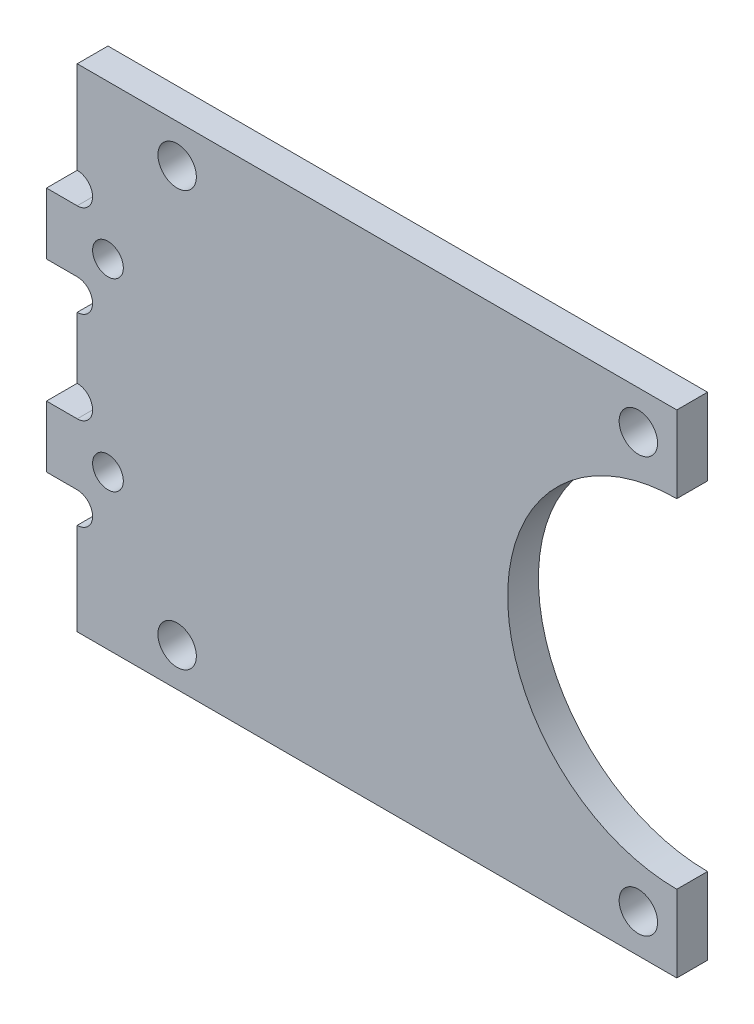
ISO-10303-21;
HEADER;
FILE_DESCRIPTION(('STEP AP214'),'2;1');
FILE_NAME('part.step','',(''),(''),'','','');
FILE_SCHEMA(('AUTOMOTIVE_DESIGN { 1 0 10303 214 1 1 1 1 }'));
ENDSEC;
DATA;
#1=APPLICATION_CONTEXT('core data for automotive mechanical design processes');
#2=APPLICATION_PROTOCOL_DEFINITION('international standard','automotive_design',2000,#1);
#3=PRODUCT_CONTEXT('',#1,'mechanical');
#4=PRODUCT('Part','Part','',(#3));
#5=PRODUCT_RELATED_PRODUCT_CATEGORY('part','',(#4));
#6=PRODUCT_DEFINITION_FORMATION('','',#4);
#7=PRODUCT_DEFINITION_CONTEXT('part definition',#1,'design');
#8=PRODUCT_DEFINITION('design','',#6,#7);
#9=PRODUCT_DEFINITION_SHAPE('','',#8);
#10=(LENGTH_UNIT() NAMED_UNIT(*) SI_UNIT(.MILLI.,.METRE.));
#11=(NAMED_UNIT(*) PLANE_ANGLE_UNIT() SI_UNIT($,.RADIAN.));
#12=(NAMED_UNIT(*) SI_UNIT($,.STERADIAN.) SOLID_ANGLE_UNIT());
#13=UNCERTAINTY_MEASURE_WITH_UNIT(LENGTH_MEASURE(1.E-05),#10,'distance_accuracy_value','');
#14=(GEOMETRIC_REPRESENTATION_CONTEXT(3) GLOBAL_UNCERTAINTY_ASSIGNED_CONTEXT((#13)) GLOBAL_UNIT_ASSIGNED_CONTEXT((#10,
#11,#12)) REPRESENTATION_CONTEXT('',''));
#15=CARTESIAN_POINT('',(0.,0.,0.));
#16=DIRECTION('',(0.,0.,1.));
#17=DIRECTION('',(1.,0.,0.));
#18=AXIS2_PLACEMENT_3D('',#15,#16,#17);
#19=CARTESIAN_POINT('',(13.2837868020581,10.1625,2.));
#20=DIRECTION('',(-1.,0.,0.));
#21=DIRECTION('',(0.,-1.,0.));
#22=AXIS2_PLACEMENT_3D('',#19,#20,#21);
#23=PLANE('',#22);
#24=DIRECTION('',(0.,1.,0.));
#25=VECTOR('',#24,1.);
#26=CARTESIAN_POINT('',(13.2837868020581,10.1625,2.));
#27=LINE('',#26,#25);
#28=CARTESIAN_POINT('',(13.2837868020581,5.1625,2.));
#29=VERTEX_POINT('',#28);
#30=CARTESIAN_POINT('',(13.2837868020581,10.1625,2.));
#31=VERTEX_POINT('',#30);
#32=EDGE_CURVE('E55',#29,#31,#27,.T.);
#33=ORIENTED_EDGE('',*,*,#32,.F.);
#34=DIRECTION('',(0.,0.,-1.));
#35=VECTOR('',#34,1.);
#36=CARTESIAN_POINT('',(13.2837868020581,5.1625,2.));
#37=LINE('',#36,#35);
#38=CARTESIAN_POINT('',(13.2837868020581,5.1625,0.));
#39=VERTEX_POINT('',#38);
#40=EDGE_CURVE('E320',#29,#39,#37,.T.);
#41=ORIENTED_EDGE('',*,*,#40,.T.);
#42=DIRECTION('',(0.,1.,0.));
#43=VECTOR('',#42,1.);
#44=CARTESIAN_POINT('',(13.2837868020581,10.1625,0.));
#45=LINE('',#44,#43);
#46=CARTESIAN_POINT('',(13.2837868020581,10.1625,0.));
#47=VERTEX_POINT('',#46);
#48=EDGE_CURVE('E114',#39,#47,#45,.T.);
#49=ORIENTED_EDGE('',*,*,#48,.T.);
#50=DIRECTION('',(0.,0.,-1.));
#51=VECTOR('',#50,1.);
#52=CARTESIAN_POINT('',(13.2837868020581,10.1625,2.));
#53=LINE('',#52,#51);
#54=EDGE_CURVE('E192',#31,#47,#53,.T.);
#55=ORIENTED_EDGE('',*,*,#54,.F.);
#56=EDGE_LOOP('',(#33,#41,#49,#55));
#57=FACE_BOUND('',#56,.T.);
#58=ADVANCED_FACE('F32',(#57),#23,.F.);
#59=CARTESIAN_POINT('',(-25.7162131979419,3.1625,2.));
#60=DIRECTION('',(0.,0.,1.));
#61=DIRECTION('',(1.,0.,0.));
#62=AXIS2_PLACEMENT_3D('',#59,#60,#61);
#63=PLANE('',#62);
#64=CARTESIAN_POINT('',(13.2837868020581,-5.8375,2.));
#65=DIRECTION('',(0.,0.,-1.));
#66=DIRECTION('',(1.,0.,0.));
#67=AXIS2_PLACEMENT_3D('',#64,#65,#66);
#68=CIRCLE('',#67,11.);
#69=CARTESIAN_POINT('',(13.2837868020581,-16.8375,2.));
#70=VERTEX_POINT('',#69);
#71=EDGE_CURVE('E47',#70,#29,#68,.T.);
#72=ORIENTED_EDGE('',*,*,#71,.T.);
#73=ORIENTED_EDGE('',*,*,#32,.T.);
#74=DIRECTION('',(-1.,0.,0.));
#75=VECTOR('',#74,1.);
#76=CARTESIAN_POINT('',(-17.2162131979419,10.1625,2.));
#77=LINE('',#76,#75);
#78=CARTESIAN_POINT('',(-25.7162131979419,10.1625,2.));
#79=VERTEX_POINT('',#78);
#80=EDGE_CURVE('E119',#31,#79,#77,.T.);
#81=ORIENTED_EDGE('',*,*,#80,.T.);
#82=DIRECTION('',(0.,-1.,0.));
#83=VECTOR('',#82,1.);
#84=CARTESIAN_POINT('',(-25.7162131979419,10.1625,2.));
#85=LINE('',#84,#83);
#86=CARTESIAN_POINT('',(-25.7162131979419,4.1625,2.));
#87=VERTEX_POINT('',#86);
#88=EDGE_CURVE('E368',#79,#87,#85,.T.);
#89=ORIENTED_EDGE('',*,*,#88,.T.);
#90=CARTESIAN_POINT('',(-25.7162131979419,3.1625,2.));
#91=DIRECTION('',(0.,0.,-1.));
#92=DIRECTION('',(1.,0.,0.));
#93=AXIS2_PLACEMENT_3D('',#90,#91,#92);
#94=CIRCLE('',#93,1.);
#95=CARTESIAN_POINT('',(-25.7162131979419,2.1625,2.));
#96=VERTEX_POINT('',#95);
#97=EDGE_CURVE('E265',#87,#96,#94,.T.);
#98=ORIENTED_EDGE('',*,*,#97,.T.);
#99=DIRECTION('',(-1.,0.,0.));
#100=VECTOR('',#99,1.);
#101=CARTESIAN_POINT('',(-25.7162131979419,2.1625,2.));
#102=LINE('',#101,#100);
#103=CARTESIAN_POINT('',(-27.7162131979419,2.1625,2.));
#104=VERTEX_POINT('',#103);
#105=EDGE_CURVE('E287',#96,#104,#102,.T.);
#106=ORIENTED_EDGE('',*,*,#105,.T.);
#107=DIRECTION('',(0.,-1.,0.));
#108=VECTOR('',#107,1.);
#109=CARTESIAN_POINT('',(-27.7162131979419,2.1625,2.));
#110=LINE('',#109,#108);
#111=CARTESIAN_POINT('',(-27.7162131979419,-1.8375,2.));
#112=VERTEX_POINT('',#111);
#113=EDGE_CURVE('E284',#104,#112,#110,.T.);
#114=ORIENTED_EDGE('',*,*,#113,.T.);
#115=DIRECTION('',(1.,0.,0.));
#116=VECTOR('',#115,1.);
#117=CARTESIAN_POINT('',(-27.7162131979419,-1.8375,2.));
#118=LINE('',#117,#116);
#119=CARTESIAN_POINT('',(-25.7162131979419,-1.8375,2.));
#120=VERTEX_POINT('',#119);
#121=EDGE_CURVE('E286',#112,#120,#118,.T.);
#122=ORIENTED_EDGE('',*,*,#121,.T.);
#123=CARTESIAN_POINT('',(-25.7162131979419,-2.8375,2.));
#124=DIRECTION('',(0.,0.,-1.));
#125=DIRECTION('',(-1.,0.,0.));
#126=AXIS2_PLACEMENT_3D('',#123,#124,#125);
#127=CIRCLE('',#126,1.);
#128=CARTESIAN_POINT('',(-25.7162131979419,-3.8375,2.));
#129=VERTEX_POINT('',#128);
#130=EDGE_CURVE('E289',#120,#129,#127,.T.);
#131=ORIENTED_EDGE('',*,*,#130,.T.);
#132=DIRECTION('',(0.,-1.,0.));
#133=VECTOR('',#132,1.);
#134=CARTESIAN_POINT('',(-25.7162131979419,-3.8375,2.));
#135=LINE('',#134,#133);
#136=CARTESIAN_POINT('',(-25.7162131979419,-7.8375,2.));
#137=VERTEX_POINT('',#136);
#138=EDGE_CURVE('E295',#129,#137,#135,.T.);
#139=ORIENTED_EDGE('',*,*,#138,.T.);
#140=CARTESIAN_POINT('',(-25.7162131979419,-8.8375,2.));
#141=DIRECTION('',(0.,0.,-1.));
#142=DIRECTION('',(1.,0.,0.));
#143=AXIS2_PLACEMENT_3D('',#140,#141,#142);
#144=CIRCLE('',#143,1.);
#145=CARTESIAN_POINT('',(-25.7162131979419,-9.8375,2.));
#146=VERTEX_POINT('',#145);
#147=EDGE_CURVE('E297',#137,#146,#144,.T.);
#148=ORIENTED_EDGE('',*,*,#147,.T.);
#149=DIRECTION('',(-1.,0.,0.));
#150=VECTOR('',#149,1.);
#151=CARTESIAN_POINT('',(-25.7162131979419,-9.8375,2.));
#152=LINE('',#151,#150);
#153=CARTESIAN_POINT('',(-27.7162131979419,-9.8375,2.));
#154=VERTEX_POINT('',#153);
#155=EDGE_CURVE('E299',#146,#154,#152,.T.);
#156=ORIENTED_EDGE('',*,*,#155,.T.);
#157=DIRECTION('',(0.,-1.,0.));
#158=VECTOR('',#157,1.);
#159=CARTESIAN_POINT('',(-27.7162131979419,-9.8375,2.));
#160=LINE('',#159,#158);
#161=CARTESIAN_POINT('',(-27.7162131979419,-13.8375,2.));
#162=VERTEX_POINT('',#161);
#163=EDGE_CURVE('E301',#154,#162,#160,.T.);
#164=ORIENTED_EDGE('',*,*,#163,.T.);
#165=DIRECTION('',(1.,0.,0.));
#166=VECTOR('',#165,1.);
#167=CARTESIAN_POINT('',(-27.7162131979419,-13.8375,2.));
#168=LINE('',#167,#166);
#169=CARTESIAN_POINT('',(-25.7162131979419,-13.8375,2.));
#170=VERTEX_POINT('',#169);
#171=EDGE_CURVE('E303',#162,#170,#168,.T.);
#172=ORIENTED_EDGE('',*,*,#171,.T.);
#173=CARTESIAN_POINT('',(-25.7162131979419,-14.8375,2.));
#174=DIRECTION('',(0.,0.,-1.));
#175=DIRECTION('',(-1.,0.,0.));
#176=AXIS2_PLACEMENT_3D('',#173,#174,#175);
#177=CIRCLE('',#176,1.);
#178=CARTESIAN_POINT('',(-25.7162131979419,-15.8375,2.));
#179=VERTEX_POINT('',#178);
#180=EDGE_CURVE('E169',#170,#179,#177,.T.);
#181=ORIENTED_EDGE('',*,*,#180,.T.);
#182=DIRECTION('',(0.,-1.,0.));
#183=VECTOR('',#182,1.);
#184=CARTESIAN_POINT('',(-25.7162131979419,-15.8375,2.));
#185=LINE('',#184,#183);
#186=CARTESIAN_POINT('',(-25.7162131979419,-21.8375,2.));
#187=VERTEX_POINT('',#186);
#188=EDGE_CURVE('E160',#179,#187,#185,.T.);
#189=ORIENTED_EDGE('',*,*,#188,.T.);
#190=DIRECTION('',(1.,0.,0.));
#191=VECTOR('',#190,1.);
#192=CARTESIAN_POINT('',(-19.7162131979419,-21.8375,2.));
#193=LINE('',#192,#191);
#194=CARTESIAN_POINT('',(13.2837868020581,-21.8375,2.));
#195=VERTEX_POINT('',#194);
#196=EDGE_CURVE('E166',#187,#195,#193,.T.);
#197=ORIENTED_EDGE('',*,*,#196,.T.);
#198=EDGE_CURVE('E188',#195,#70,#27,.T.);
#199=ORIENTED_EDGE('',*,*,#198,.T.);
#200=EDGE_LOOP('',(#72,#73,#81,#89,#98,#106,#114,#122,#131,#139,#148,#156,#164,#172,#181,#189,
#197,#199));
#201=FACE_BOUND('',#200,.T.);
#202=CARTESIAN_POINT('',(-23.7162131979419,-11.8375,2.));
#203=DIRECTION('',(0.,0.,1.));
#204=DIRECTION('',(1.,0.,0.));
#205=AXIS2_PLACEMENT_3D('',#202,#203,#204);
#206=CIRCLE('',#205,1.);
#207=CARTESIAN_POINT('',(-22.7162131979419,-11.8375,2.));
#208=VERTEX_POINT('',#207);
#209=EDGE_CURVE('E339',#208,#208,#206,.T.);
#210=ORIENTED_EDGE('',*,*,#209,.F.);
#211=EDGE_LOOP('',(#210));
#212=FACE_BOUND('',#211,.T.);
#213=CARTESIAN_POINT('',(10.7837868020581,7.6625,2.));
#214=DIRECTION('',(0.,0.,1.));
#215=DIRECTION('',(1.,0.,0.));
#216=AXIS2_PLACEMENT_3D('',#213,#214,#215);
#217=CIRCLE('',#216,1.25);
#218=CARTESIAN_POINT('',(12.0337868020581,7.6625,2.));
#219=VERTEX_POINT('',#218);
#220=EDGE_CURVE('E351',#219,#219,#217,.T.);
#221=ORIENTED_EDGE('',*,*,#220,.F.);
#222=EDGE_LOOP('',(#221));
#223=FACE_BOUND('',#222,.T.);
#224=CARTESIAN_POINT('',(-19.2162131979419,7.6625,2.));
#225=DIRECTION('',(0.,0.,1.));
#226=DIRECTION('',(1.,0.,0.));
#227=AXIS2_PLACEMENT_3D('',#224,#225,#226);
#228=CIRCLE('',#227,1.25);
#229=CARTESIAN_POINT('',(-17.9662131979419,7.6625,2.));
#230=VERTEX_POINT('',#229);
#231=EDGE_CURVE('E196',#230,#230,#228,.T.);
#232=ORIENTED_EDGE('',*,*,#231,.F.);
#233=EDGE_LOOP('',(#232));
#234=FACE_BOUND('',#233,.T.);
#235=CARTESIAN_POINT('',(10.7837868020581,-19.3375,2.));
#236=DIRECTION('',(0.,0.,1.));
#237=DIRECTION('',(1.,0.,0.));
#238=AXIS2_PLACEMENT_3D('',#235,#236,#237);
#239=CIRCLE('',#238,1.25);
#240=CARTESIAN_POINT('',(12.0337868020581,-19.3375,2.));
#241=VERTEX_POINT('',#240);
#242=EDGE_CURVE('E357',#241,#241,#239,.T.);
#243=ORIENTED_EDGE('',*,*,#242,.F.);
#244=EDGE_LOOP('',(#243));
#245=FACE_BOUND('',#244,.T.);
#246=CARTESIAN_POINT('',(-19.2162131979419,-19.3375,2.));
#247=DIRECTION('',(0.,0.,1.));
#248=DIRECTION('',(1.,0.,0.));
#249=AXIS2_PLACEMENT_3D('',#246,#247,#248);
#250=CIRCLE('',#249,1.25);
#251=CARTESIAN_POINT('',(-17.9662131979419,-19.3375,2.));
#252=VERTEX_POINT('',#251);
#253=EDGE_CURVE('E345',#252,#252,#250,.T.);
#254=ORIENTED_EDGE('',*,*,#253,.F.);
#255=EDGE_LOOP('',(#254));
#256=FACE_BOUND('',#255,.T.);
#257=CARTESIAN_POINT('',(-23.7162131979419,0.162500000000001,2.));
#258=DIRECTION('',(0.,0.,1.));
#259=DIRECTION('',(1.,0.,0.));
#260=AXIS2_PLACEMENT_3D('',#257,#258,#259);
#261=CIRCLE('',#260,1.);
#262=CARTESIAN_POINT('',(-22.7162131979419,0.162500000000001,2.));
#263=VERTEX_POINT('',#262);
#264=EDGE_CURVE('E331',#263,#263,#261,.T.);
#265=ORIENTED_EDGE('',*,*,#264,.F.);
#266=EDGE_LOOP('',(#265));
#267=FACE_BOUND('',#266,.T.);
#268=ADVANCED_FACE('F162',(#201,#212,#223,#234,#245,#256,#267),#63,.T.);
#269=CARTESIAN_POINT('',(-25.7162131979419,3.1625,0.));
#270=DIRECTION('',(0.,0.,1.));
#271=DIRECTION('',(1.,0.,0.));
#272=AXIS2_PLACEMENT_3D('',#269,#270,#271);
#273=PLANE('',#272);
#274=ORIENTED_EDGE('',*,*,#48,.F.);
#275=CARTESIAN_POINT('',(13.2837868020581,-5.8375,0.));
#276=DIRECTION('',(0.,0.,-1.));
#277=DIRECTION('',(1.,0.,0.));
#278=AXIS2_PLACEMENT_3D('',#275,#276,#277);
#279=CIRCLE('',#278,11.);
#280=CARTESIAN_POINT('',(13.2837868020581,-16.8375,0.));
#281=VERTEX_POINT('',#280);
#282=EDGE_CURVE('E321',#281,#39,#279,.T.);
#283=ORIENTED_EDGE('',*,*,#282,.F.);
#284=CARTESIAN_POINT('',(13.2837868020581,-21.8375,0.));
#285=VERTEX_POINT('',#284);
#286=EDGE_CURVE('E221',#285,#281,#45,.T.);
#287=ORIENTED_EDGE('',*,*,#286,.F.);
#288=DIRECTION('',(1.,0.,0.));
#289=VECTOR('',#288,1.);
#290=CARTESIAN_POINT('',(13.2837868020581,-21.8375,0.));
#291=LINE('',#290,#289);
#292=CARTESIAN_POINT('',(-25.7162131979419,-21.8375,0.));
#293=VERTEX_POINT('',#292);
#294=EDGE_CURVE('E219',#293,#285,#291,.T.);
#295=ORIENTED_EDGE('',*,*,#294,.F.);
#296=DIRECTION('',(0.,-1.,0.));
#297=VECTOR('',#296,1.);
#298=CARTESIAN_POINT('',(-25.7162131979419,-15.8375,0.));
#299=LINE('',#298,#297);
#300=CARTESIAN_POINT('',(-25.7162131979419,-15.8375,0.));
#301=VERTEX_POINT('',#300);
#302=EDGE_CURVE('E179',#301,#293,#299,.T.);
#303=ORIENTED_EDGE('',*,*,#302,.F.);
#304=CARTESIAN_POINT('',(-25.7162131979419,-14.8375,0.));
#305=DIRECTION('',(0.,0.,-1.));
#306=DIRECTION('',(-1.,0.,0.));
#307=AXIS2_PLACEMENT_3D('',#304,#305,#306);
#308=CIRCLE('',#307,1.);
#309=CARTESIAN_POINT('',(-25.7162131979419,-13.8375,0.));
#310=VERTEX_POINT('',#309);
#311=EDGE_CURVE('E216',#310,#301,#308,.T.);
#312=ORIENTED_EDGE('',*,*,#311,.F.);
#313=DIRECTION('',(1.,0.,0.));
#314=VECTOR('',#313,1.);
#315=CARTESIAN_POINT('',(-27.7162131979419,-13.8375,0.));
#316=LINE('',#315,#314);
#317=CARTESIAN_POINT('',(-27.7162131979419,-13.8375,0.));
#318=VERTEX_POINT('',#317);
#319=EDGE_CURVE('E214',#318,#310,#316,.T.);
#320=ORIENTED_EDGE('',*,*,#319,.F.);
#321=DIRECTION('',(0.,-1.,0.));
#322=VECTOR('',#321,1.);
#323=CARTESIAN_POINT('',(-27.7162131979419,-9.8375,0.));
#324=LINE('',#323,#322);
#325=CARTESIAN_POINT('',(-27.7162131979419,-9.8375,0.));
#326=VERTEX_POINT('',#325);
#327=EDGE_CURVE('E212',#326,#318,#324,.T.);
#328=ORIENTED_EDGE('',*,*,#327,.F.);
#329=DIRECTION('',(-1.,0.,0.));
#330=VECTOR('',#329,1.);
#331=CARTESIAN_POINT('',(-25.7162131979419,-9.8375,0.));
#332=LINE('',#331,#330);
#333=CARTESIAN_POINT('',(-25.7162131979419,-9.8375,0.));
#334=VERTEX_POINT('',#333);
#335=EDGE_CURVE('E210',#334,#326,#332,.T.);
#336=ORIENTED_EDGE('',*,*,#335,.F.);
#337=CARTESIAN_POINT('',(-25.7162131979419,-8.8375,0.));
#338=DIRECTION('',(0.,0.,-1.));
#339=DIRECTION('',(1.,0.,0.));
#340=AXIS2_PLACEMENT_3D('',#337,#338,#339);
#341=CIRCLE('',#340,1.);
#342=CARTESIAN_POINT('',(-25.7162131979419,-7.8375,0.));
#343=VERTEX_POINT('',#342);
#344=EDGE_CURVE('E208',#343,#334,#341,.T.);
#345=ORIENTED_EDGE('',*,*,#344,.F.);
#346=DIRECTION('',(0.,-1.,0.));
#347=VECTOR('',#346,1.);
#348=CARTESIAN_POINT('',(-25.7162131979419,-3.8375,0.));
#349=LINE('',#348,#347);
#350=CARTESIAN_POINT('',(-25.7162131979419,-3.8375,0.));
#351=VERTEX_POINT('',#350);
#352=EDGE_CURVE('E206',#351,#343,#349,.T.);
#353=ORIENTED_EDGE('',*,*,#352,.F.);
#354=CARTESIAN_POINT('',(-25.7162131979419,-2.8375,0.));
#355=DIRECTION('',(0.,0.,-1.));
#356=DIRECTION('',(-1.,0.,0.));
#357=AXIS2_PLACEMENT_3D('',#354,#355,#356);
#358=CIRCLE('',#357,1.);
#359=CARTESIAN_POINT('',(-25.7162131979419,-1.8375,0.));
#360=VERTEX_POINT('',#359);
#361=EDGE_CURVE('E204',#360,#351,#358,.T.);
#362=ORIENTED_EDGE('',*,*,#361,.F.);
#363=DIRECTION('',(1.,0.,0.));
#364=VECTOR('',#363,1.);
#365=CARTESIAN_POINT('',(-27.7162131979419,-1.8375,0.));
#366=LINE('',#365,#364);
#367=CARTESIAN_POINT('',(-27.7162131979419,-1.8375,0.));
#368=VERTEX_POINT('',#367);
#369=EDGE_CURVE('E202',#368,#360,#366,.T.);
#370=ORIENTED_EDGE('',*,*,#369,.F.);
#371=DIRECTION('',(0.,-1.,0.));
#372=VECTOR('',#371,1.);
#373=CARTESIAN_POINT('',(-27.7162131979419,2.1625,0.));
#374=LINE('',#373,#372);
#375=CARTESIAN_POINT('',(-27.7162131979419,2.1625,0.));
#376=VERTEX_POINT('',#375);
#377=EDGE_CURVE('E200',#376,#368,#374,.T.);
#378=ORIENTED_EDGE('',*,*,#377,.F.);
#379=DIRECTION('',(-1.,0.,0.));
#380=VECTOR('',#379,1.);
#381=CARTESIAN_POINT('',(-25.7162131979419,2.1625,0.));
#382=LINE('',#381,#380);
#383=CARTESIAN_POINT('',(-25.7162131979419,2.1625,0.));
#384=VERTEX_POINT('',#383);
#385=EDGE_CURVE('E198',#384,#376,#382,.T.);
#386=ORIENTED_EDGE('',*,*,#385,.F.);
#387=CARTESIAN_POINT('',(-25.7162131979419,3.1625,0.));
#388=DIRECTION('',(0.,0.,-1.));
#389=DIRECTION('',(1.,0.,0.));
#390=AXIS2_PLACEMENT_3D('',#387,#388,#389);
#391=CIRCLE('',#390,1.);
#392=CARTESIAN_POINT('',(-25.7162131979419,4.1625,0.));
#393=VERTEX_POINT('',#392);
#394=EDGE_CURVE('E195',#393,#384,#391,.T.);
#395=ORIENTED_EDGE('',*,*,#394,.F.);
#396=DIRECTION('',(0.,-1.,0.));
#397=VECTOR('',#396,1.);
#398=CARTESIAN_POINT('',(-25.7162131979419,10.1625,0.));
#399=LINE('',#398,#397);
#400=CARTESIAN_POINT('',(-25.7162131979419,10.1625,0.));
#401=VERTEX_POINT('',#400);
#402=EDGE_CURVE('E193',#401,#393,#399,.T.);
#403=ORIENTED_EDGE('',*,*,#402,.F.);
#404=DIRECTION('',(-1.,0.,0.));
#405=VECTOR('',#404,1.);
#406=CARTESIAN_POINT('',(-17.2162131979419,10.1625,0.));
#407=LINE('',#406,#405);
#408=EDGE_CURVE('E224',#47,#401,#407,.T.);
#409=ORIENTED_EDGE('',*,*,#408,.F.);
#410=EDGE_LOOP('',(#274,#283,#287,#295,#303,#312,#320,#328,#336,#345,#353,#362,#370,#378,#386,
#395,#403,#409));
#411=FACE_BOUND('',#410,.T.);
#412=CARTESIAN_POINT('',(-19.2162131979419,7.6625,0.));
#413=DIRECTION('',(0.,0.,1.));
#414=DIRECTION('',(1.,0.,0.));
#415=AXIS2_PLACEMENT_3D('',#412,#413,#414);
#416=CIRCLE('',#415,1.25);
#417=CARTESIAN_POINT('',(-17.9662131979419,7.6625,0.));
#418=VERTEX_POINT('',#417);
#419=EDGE_CURVE('E360',#418,#418,#416,.T.);
#420=ORIENTED_EDGE('',*,*,#419,.T.);
#421=EDGE_LOOP('',(#420));
#422=FACE_BOUND('',#421,.T.);
#423=CARTESIAN_POINT('',(10.7837868020581,-19.3375,0.));
#424=DIRECTION('',(0.,0.,1.));
#425=DIRECTION('',(1.,0.,0.));
#426=AXIS2_PLACEMENT_3D('',#423,#424,#425);
#427=CIRCLE('',#426,1.25);
#428=CARTESIAN_POINT('',(12.0337868020581,-19.3375,0.));
#429=VERTEX_POINT('',#428);
#430=EDGE_CURVE('E354',#429,#429,#427,.T.);
#431=ORIENTED_EDGE('',*,*,#430,.T.);
#432=EDGE_LOOP('',(#431));
#433=FACE_BOUND('',#432,.T.);
#434=CARTESIAN_POINT('',(10.7837868020581,7.6625,0.));
#435=DIRECTION('',(0.,0.,1.));
#436=DIRECTION('',(1.,0.,0.));
#437=AXIS2_PLACEMENT_3D('',#434,#435,#436);
#438=CIRCLE('',#437,1.25);
#439=CARTESIAN_POINT('',(12.0337868020581,7.6625,0.));
#440=VERTEX_POINT('',#439);
#441=EDGE_CURVE('E348',#440,#440,#438,.T.);
#442=ORIENTED_EDGE('',*,*,#441,.T.);
#443=EDGE_LOOP('',(#442));
#444=FACE_BOUND('',#443,.T.);
#445=CARTESIAN_POINT('',(-19.2162131979419,-19.3375,0.));
#446=DIRECTION('',(0.,0.,1.));
#447=DIRECTION('',(1.,0.,0.));
#448=AXIS2_PLACEMENT_3D('',#445,#446,#447);
#449=CIRCLE('',#448,1.25);
#450=CARTESIAN_POINT('',(-17.9662131979419,-19.3375,0.));
#451=VERTEX_POINT('',#450);
#452=EDGE_CURVE('E342',#451,#451,#449,.T.);
#453=ORIENTED_EDGE('',*,*,#452,.T.);
#454=EDGE_LOOP('',(#453));
#455=FACE_BOUND('',#454,.T.);
#456=CARTESIAN_POINT('',(-23.7162131979419,-11.8375,0.));
#457=DIRECTION('',(0.,0.,1.));
#458=DIRECTION('',(1.,0.,0.));
#459=AXIS2_PLACEMENT_3D('',#456,#457,#458);
#460=CIRCLE('',#459,1.);
#461=CARTESIAN_POINT('',(-22.7162131979419,-11.8375,0.));
#462=VERTEX_POINT('',#461);
#463=EDGE_CURVE('E337',#462,#462,#460,.T.);
#464=ORIENTED_EDGE('',*,*,#463,.T.);
#465=EDGE_LOOP('',(#464));
#466=FACE_BOUND('',#465,.T.);
#467=CARTESIAN_POINT('',(-23.7162131979419,0.162500000000001,0.));
#468=DIRECTION('',(0.,0.,1.));
#469=DIRECTION('',(1.,0.,0.));
#470=AXIS2_PLACEMENT_3D('',#467,#468,#469);
#471=CIRCLE('',#470,1.);
#472=CARTESIAN_POINT('',(-22.7162131979419,0.162500000000001,0.));
#473=VERTEX_POINT('',#472);
#474=EDGE_CURVE('E328',#473,#473,#471,.T.);
#475=ORIENTED_EDGE('',*,*,#474,.T.);
#476=EDGE_LOOP('',(#475));
#477=FACE_BOUND('',#476,.T.);
#478=ADVANCED_FACE('F271',(#411,#422,#433,#444,#455,#466,#477),#273,.F.);
#479=CARTESIAN_POINT('',(-25.7162131979419,10.1625,2.));
#480=DIRECTION('',(1.,0.,0.));
#481=DIRECTION('',(0.,0.,-1.));
#482=AXIS2_PLACEMENT_3D('',#479,#480,#481);
#483=PLANE('',#482);
#484=ORIENTED_EDGE('',*,*,#402,.T.);
#485=DIRECTION('',(0.,0.,-1.));
#486=VECTOR('',#485,1.);
#487=CARTESIAN_POINT('',(-25.7162131979419,4.1625,2.));
#488=LINE('',#487,#486);
#489=EDGE_CURVE('E40',#87,#393,#488,.T.);
#490=ORIENTED_EDGE('',*,*,#489,.F.);
#491=ORIENTED_EDGE('',*,*,#88,.F.);
#492=DIRECTION('',(0.,0.,-1.));
#493=VECTOR('',#492,1.);
#494=CARTESIAN_POINT('',(-25.7162131979419,10.1625,2.));
#495=LINE('',#494,#493);
#496=EDGE_CURVE('E11',#79,#401,#495,.T.);
#497=ORIENTED_EDGE('',*,*,#496,.T.);
#498=EDGE_LOOP('',(#484,#490,#491,#497));
#499=FACE_BOUND('',#498,.T.);
#500=ADVANCED_FACE('F34',(#499),#483,.F.);
#501=CARTESIAN_POINT('',(-25.7162131979419,3.1625,2.));
#502=DIRECTION('',(0.,0.,-1.));
#503=DIRECTION('',(-1.,0.,0.));
#504=AXIS2_PLACEMENT_3D('',#501,#502,#503);
#505=CYLINDRICAL_SURFACE('',#504,1.);
#506=ORIENTED_EDGE('',*,*,#394,.T.);
#507=DIRECTION('',(0.,0.,-1.));
#508=VECTOR('',#507,1.);
#509=CARTESIAN_POINT('',(-25.7162131979419,2.1625,2.));
#510=LINE('',#509,#508);
#511=EDGE_CURVE('E256',#96,#384,#510,.T.);
#512=ORIENTED_EDGE('',*,*,#511,.F.);
#513=ORIENTED_EDGE('',*,*,#97,.F.);
#514=ORIENTED_EDGE('',*,*,#489,.T.);
#515=EDGE_LOOP('',(#506,#512,#513,#514));
#516=FACE_BOUND('',#515,.T.);
#517=ADVANCED_FACE('F263',(#516),#505,.F.);
#518=CARTESIAN_POINT('',(-25.7162131979419,2.1625,2.));
#519=DIRECTION('',(0.,-1.,0.));
#520=DIRECTION('',(0.,0.,-1.));
#521=AXIS2_PLACEMENT_3D('',#518,#519,#520);
#522=PLANE('',#521);
#523=ORIENTED_EDGE('',*,*,#385,.T.);
#524=DIRECTION('',(0.,0.,-1.));
#525=VECTOR('',#524,1.);
#526=CARTESIAN_POINT('',(-27.7162131979419,2.1625,2.));
#527=LINE('',#526,#525);
#528=EDGE_CURVE('E253',#104,#376,#527,.T.);
#529=ORIENTED_EDGE('',*,*,#528,.F.);
#530=ORIENTED_EDGE('',*,*,#105,.F.);
#531=ORIENTED_EDGE('',*,*,#511,.T.);
#532=EDGE_LOOP('',(#523,#529,#530,#531));
#533=FACE_BOUND('',#532,.T.);
#534=ADVANCED_FACE('F278',(#533),#522,.F.);
#535=CARTESIAN_POINT('',(-27.7162131979419,2.1625,2.));
#536=DIRECTION('',(1.,0.,0.));
#537=DIRECTION('',(0.,0.,-1.));
#538=AXIS2_PLACEMENT_3D('',#535,#536,#537);
#539=PLANE('',#538);
#540=ORIENTED_EDGE('',*,*,#377,.T.);
#541=DIRECTION('',(0.,0.,-1.));
#542=VECTOR('',#541,1.);
#543=CARTESIAN_POINT('',(-27.7162131979419,-1.8375,2.));
#544=LINE('',#543,#542);
#545=EDGE_CURVE('E250',#112,#368,#544,.T.);
#546=ORIENTED_EDGE('',*,*,#545,.F.);
#547=ORIENTED_EDGE('',*,*,#113,.F.);
#548=ORIENTED_EDGE('',*,*,#528,.T.);
#549=EDGE_LOOP('',(#540,#546,#547,#548));
#550=FACE_BOUND('',#549,.T.);
#551=ADVANCED_FACE('F282',(#550),#539,.F.);
#552=CARTESIAN_POINT('',(-27.7162131979419,-1.8375,2.));
#553=DIRECTION('',(0.,1.,0.));
#554=DIRECTION('',(0.,0.,1.));
#555=AXIS2_PLACEMENT_3D('',#552,#553,#554);
#556=PLANE('',#555);
#557=ORIENTED_EDGE('',*,*,#369,.T.);
#558=DIRECTION('',(0.,0.,-1.));
#559=VECTOR('',#558,1.);
#560=CARTESIAN_POINT('',(-25.7162131979419,-1.8375,2.));
#561=LINE('',#560,#559);
#562=EDGE_CURVE('E247',#120,#360,#561,.T.);
#563=ORIENTED_EDGE('',*,*,#562,.F.);
#564=ORIENTED_EDGE('',*,*,#121,.F.);
#565=ORIENTED_EDGE('',*,*,#545,.T.);
#566=EDGE_LOOP('',(#557,#563,#564,#565));
#567=FACE_BOUND('',#566,.T.);
#568=ADVANCED_FACE('F417',(#567),#556,.F.);
#569=CARTESIAN_POINT('',(-25.7162131979419,-2.8375,2.));
#570=DIRECTION('',(0.,0.,-1.));
#571=DIRECTION('',(-1.,0.,0.));
#572=AXIS2_PLACEMENT_3D('',#569,#570,#571);
#573=CYLINDRICAL_SURFACE('',#572,1.);
#574=ORIENTED_EDGE('',*,*,#361,.T.);
#575=DIRECTION('',(0.,0.,-1.));
#576=VECTOR('',#575,1.);
#577=CARTESIAN_POINT('',(-25.7162131979419,-3.8375,2.));
#578=LINE('',#577,#576);
#579=EDGE_CURVE('E244',#129,#351,#578,.T.);
#580=ORIENTED_EDGE('',*,*,#579,.F.);
#581=ORIENTED_EDGE('',*,*,#130,.F.);
#582=ORIENTED_EDGE('',*,*,#562,.T.);
#583=EDGE_LOOP('',(#574,#580,#581,#582));
#584=FACE_BOUND('',#583,.T.);
#585=ADVANCED_FACE('F413',(#584),#573,.F.);
#586=CARTESIAN_POINT('',(-25.7162131979419,-3.8375,2.));
#587=DIRECTION('',(1.,0.,0.));
#588=DIRECTION('',(0.,1.,0.));
#589=AXIS2_PLACEMENT_3D('',#586,#587,#588);
#590=PLANE('',#589);
#591=ORIENTED_EDGE('',*,*,#352,.T.);
#592=DIRECTION('',(0.,0.,-1.));
#593=VECTOR('',#592,1.);
#594=CARTESIAN_POINT('',(-25.7162131979419,-7.8375,2.));
#595=LINE('',#594,#593);
#596=EDGE_CURVE('E241',#137,#343,#595,.T.);
#597=ORIENTED_EDGE('',*,*,#596,.F.);
#598=ORIENTED_EDGE('',*,*,#138,.F.);
#599=ORIENTED_EDGE('',*,*,#579,.T.);
#600=EDGE_LOOP('',(#591,#597,#598,#599));
#601=FACE_BOUND('',#600,.T.);
#602=ADVANCED_FACE('F409',(#601),#590,.F.);
#603=CARTESIAN_POINT('',(-25.7162131979419,-8.8375,2.));
#604=DIRECTION('',(0.,0.,-1.));
#605=DIRECTION('',(-1.,0.,0.));
#606=AXIS2_PLACEMENT_3D('',#603,#604,#605);
#607=CYLINDRICAL_SURFACE('',#606,1.);
#608=ORIENTED_EDGE('',*,*,#344,.T.);
#609=DIRECTION('',(0.,0.,-1.));
#610=VECTOR('',#609,1.);
#611=CARTESIAN_POINT('',(-25.7162131979419,-9.8375,2.));
#612=LINE('',#611,#610);
#613=EDGE_CURVE('E238',#146,#334,#612,.T.);
#614=ORIENTED_EDGE('',*,*,#613,.F.);
#615=ORIENTED_EDGE('',*,*,#147,.F.);
#616=ORIENTED_EDGE('',*,*,#596,.T.);
#617=EDGE_LOOP('',(#608,#614,#615,#616));
#618=FACE_BOUND('',#617,.T.);
#619=ADVANCED_FACE('F405',(#618),#607,.F.);
#620=CARTESIAN_POINT('',(-25.7162131979419,-9.8375,2.));
#621=DIRECTION('',(0.,-1.,0.));
#622=DIRECTION('',(0.,0.,-1.));
#623=AXIS2_PLACEMENT_3D('',#620,#621,#622);
#624=PLANE('',#623);
#625=ORIENTED_EDGE('',*,*,#335,.T.);
#626=DIRECTION('',(0.,0.,-1.));
#627=VECTOR('',#626,1.);
#628=CARTESIAN_POINT('',(-27.7162131979419,-9.8375,2.));
#629=LINE('',#628,#627);
#630=EDGE_CURVE('E235',#154,#326,#629,.T.);
#631=ORIENTED_EDGE('',*,*,#630,.F.);
#632=ORIENTED_EDGE('',*,*,#155,.F.);
#633=ORIENTED_EDGE('',*,*,#613,.T.);
#634=EDGE_LOOP('',(#625,#631,#632,#633));
#635=FACE_BOUND('',#634,.T.);
#636=ADVANCED_FACE('F401',(#635),#624,.F.);
#637=CARTESIAN_POINT('',(-27.7162131979419,-9.8375,2.));
#638=DIRECTION('',(1.,0.,0.));
#639=DIRECTION('',(0.,0.,-1.));
#640=AXIS2_PLACEMENT_3D('',#637,#638,#639);
#641=PLANE('',#640);
#642=ORIENTED_EDGE('',*,*,#327,.T.);
#643=DIRECTION('',(0.,0.,-1.));
#644=VECTOR('',#643,1.);
#645=CARTESIAN_POINT('',(-27.7162131979419,-13.8375,2.));
#646=LINE('',#645,#644);
#647=EDGE_CURVE('E232',#162,#318,#646,.T.);
#648=ORIENTED_EDGE('',*,*,#647,.F.);
#649=ORIENTED_EDGE('',*,*,#163,.F.);
#650=ORIENTED_EDGE('',*,*,#630,.T.);
#651=EDGE_LOOP('',(#642,#648,#649,#650));
#652=FACE_BOUND('',#651,.T.);
#653=ADVANCED_FACE('F398',(#652),#641,.F.);
#654=CARTESIAN_POINT('',(-27.7162131979419,-13.8375,2.));
#655=DIRECTION('',(0.,1.,0.));
#656=DIRECTION('',(0.,0.,1.));
#657=AXIS2_PLACEMENT_3D('',#654,#655,#656);
#658=PLANE('',#657);
#659=ORIENTED_EDGE('',*,*,#319,.T.);
#660=DIRECTION('',(0.,0.,-1.));
#661=VECTOR('',#660,1.);
#662=CARTESIAN_POINT('',(-25.7162131979419,-13.8375,2.));
#663=LINE('',#662,#661);
#664=EDGE_CURVE('E229',#170,#310,#663,.T.);
#665=ORIENTED_EDGE('',*,*,#664,.F.);
#666=ORIENTED_EDGE('',*,*,#171,.F.);
#667=ORIENTED_EDGE('',*,*,#647,.T.);
#668=EDGE_LOOP('',(#659,#665,#666,#667));
#669=FACE_BOUND('',#668,.T.);
#670=ADVANCED_FACE('F309',(#669),#658,.F.);
#671=CARTESIAN_POINT('',(-25.7162131979419,-14.8375,2.));
#672=DIRECTION('',(0.,0.,-1.));
#673=DIRECTION('',(-1.,0.,0.));
#674=AXIS2_PLACEMENT_3D('',#671,#672,#673);
#675=CYLINDRICAL_SURFACE('',#674,1.);
#676=ORIENTED_EDGE('',*,*,#311,.T.);
#677=DIRECTION('',(0.,0.,-1.));
#678=VECTOR('',#677,1.);
#679=CARTESIAN_POINT('',(-25.7162131979419,-15.8375,2.));
#680=LINE('',#679,#678);
#681=EDGE_CURVE('E181',#179,#301,#680,.T.);
#682=ORIENTED_EDGE('',*,*,#681,.F.);
#683=ORIENTED_EDGE('',*,*,#180,.F.);
#684=ORIENTED_EDGE('',*,*,#664,.T.);
#685=EDGE_LOOP('',(#676,#682,#683,#684));
#686=FACE_BOUND('',#685,.T.);
#687=ADVANCED_FACE('F313',(#686),#675,.F.);
#688=CARTESIAN_POINT('',(-25.7162131979419,-15.8375,2.));
#689=DIRECTION('',(1.,0.,0.));
#690=DIRECTION('',(0.,1.,0.));
#691=AXIS2_PLACEMENT_3D('',#688,#689,#690);
#692=PLANE('',#691);
#693=ORIENTED_EDGE('',*,*,#302,.T.);
#694=DIRECTION('',(0.,0.,-1.));
#695=VECTOR('',#694,1.);
#696=CARTESIAN_POINT('',(-25.7162131979419,-21.8375,2.));
#697=LINE('',#696,#695);
#698=EDGE_CURVE('E176',#187,#293,#697,.T.);
#699=ORIENTED_EDGE('',*,*,#698,.F.);
#700=ORIENTED_EDGE('',*,*,#188,.F.);
#701=ORIENTED_EDGE('',*,*,#681,.T.);
#702=EDGE_LOOP('',(#693,#699,#700,#701));
#703=FACE_BOUND('',#702,.T.);
#704=ADVANCED_FACE('F177',(#703),#692,.F.);
#705=CARTESIAN_POINT('',(13.2837868020581,-21.8375,2.));
#706=DIRECTION('',(0.,1.,0.));
#707=DIRECTION('',(-1.,0.,0.));
#708=AXIS2_PLACEMENT_3D('',#705,#706,#707);
#709=PLANE('',#708);
#710=ORIENTED_EDGE('',*,*,#294,.T.);
#711=DIRECTION('',(0.,0.,-1.));
#712=VECTOR('',#711,1.);
#713=CARTESIAN_POINT('',(13.2837868020581,-21.8375,2.));
#714=LINE('',#713,#712);
#715=EDGE_CURVE('E182',#195,#285,#714,.T.);
#716=ORIENTED_EDGE('',*,*,#715,.F.);
#717=ORIENTED_EDGE('',*,*,#196,.F.);
#718=ORIENTED_EDGE('',*,*,#698,.T.);
#719=EDGE_LOOP('',(#710,#716,#717,#718));
#720=FACE_BOUND('',#719,.T.);
#721=ADVANCED_FACE('F184',(#720),#709,.F.);
#722=ORIENTED_EDGE('',*,*,#286,.T.);
#723=DIRECTION('',(0.,0.,-1.));
#724=VECTOR('',#723,1.);
#725=CARTESIAN_POINT('',(13.2837868020581,-16.8375,2.));
#726=LINE('',#725,#724);
#727=EDGE_CURVE('E318',#70,#281,#726,.T.);
#728=ORIENTED_EDGE('',*,*,#727,.F.);
#729=ORIENTED_EDGE('',*,*,#198,.F.);
#730=ORIENTED_EDGE('',*,*,#715,.T.);
#731=EDGE_LOOP('',(#722,#728,#729,#730));
#732=FACE_BOUND('',#731,.T.);
#733=ADVANCED_FACE('F317',(#732),#23,.F.);
#734=CARTESIAN_POINT('',(-17.2162131979419,10.1625,2.));
#735=DIRECTION('',(0.,-1.,0.));
#736=DIRECTION('',(0.,0.,-1.));
#737=AXIS2_PLACEMENT_3D('',#734,#735,#736);
#738=PLANE('',#737);
#739=ORIENTED_EDGE('',*,*,#408,.T.);
#740=ORIENTED_EDGE('',*,*,#496,.F.);
#741=ORIENTED_EDGE('',*,*,#80,.F.);
#742=ORIENTED_EDGE('',*,*,#54,.T.);
#743=EDGE_LOOP('',(#739,#740,#741,#742));
#744=FACE_BOUND('',#743,.T.);
#745=ADVANCED_FACE('F325',(#744),#738,.F.);
#746=CARTESIAN_POINT('',(-19.2162131979419,7.6625,2.));
#747=DIRECTION('',(0.,0.,-1.));
#748=DIRECTION('',(-1.,0.,0.));
#749=AXIS2_PLACEMENT_3D('',#746,#747,#748);
#750=CYLINDRICAL_SURFACE('',#749,1.25);
#751=ORIENTED_EDGE('',*,*,#231,.T.);
#752=EDGE_LOOP('',(#751));
#753=FACE_BOUND('',#752,.T.);
#754=ORIENTED_EDGE('',*,*,#419,.F.);
#755=EDGE_LOOP('',(#754));
#756=FACE_BOUND('',#755,.T.);
#757=ADVANCED_FACE('F388',(#753,#756),#750,.F.);
#758=CARTESIAN_POINT('',(10.7837868020581,-19.3375,2.));
#759=DIRECTION('',(0.,0.,-1.));
#760=DIRECTION('',(-1.,0.,0.));
#761=AXIS2_PLACEMENT_3D('',#758,#759,#760);
#762=CYLINDRICAL_SURFACE('',#761,1.25);
#763=ORIENTED_EDGE('',*,*,#242,.T.);
#764=EDGE_LOOP('',(#763));
#765=FACE_BOUND('',#764,.T.);
#766=ORIENTED_EDGE('',*,*,#430,.F.);
#767=EDGE_LOOP('',(#766));
#768=FACE_BOUND('',#767,.T.);
#769=ADVANCED_FACE('F492',(#765,#768),#762,.F.);
#770=CARTESIAN_POINT('',(10.7837868020581,7.6625,2.));
#771=DIRECTION('',(0.,0.,-1.));
#772=DIRECTION('',(-1.,0.,0.));
#773=AXIS2_PLACEMENT_3D('',#770,#771,#772);
#774=CYLINDRICAL_SURFACE('',#773,1.25);
#775=ORIENTED_EDGE('',*,*,#220,.T.);
#776=EDGE_LOOP('',(#775));
#777=FACE_BOUND('',#776,.T.);
#778=ORIENTED_EDGE('',*,*,#441,.F.);
#779=EDGE_LOOP('',(#778));
#780=FACE_BOUND('',#779,.T.);
#781=ADVANCED_FACE('F502',(#777,#780),#774,.F.);
#782=CARTESIAN_POINT('',(-19.2162131979419,-19.3375,2.));
#783=DIRECTION('',(0.,0.,-1.));
#784=DIRECTION('',(-1.,0.,0.));
#785=AXIS2_PLACEMENT_3D('',#782,#783,#784);
#786=CYLINDRICAL_SURFACE('',#785,1.25);
#787=ORIENTED_EDGE('',*,*,#253,.T.);
#788=EDGE_LOOP('',(#787));
#789=FACE_BOUND('',#788,.T.);
#790=ORIENTED_EDGE('',*,*,#452,.F.);
#791=EDGE_LOOP('',(#790));
#792=FACE_BOUND('',#791,.T.);
#793=ADVANCED_FACE('F512',(#789,#792),#786,.F.);
#794=CARTESIAN_POINT('',(-23.7162131979419,-11.8375,2.));
#795=DIRECTION('',(0.,0.,-1.));
#796=DIRECTION('',(-1.,0.,0.));
#797=AXIS2_PLACEMENT_3D('',#794,#795,#796);
#798=CYLINDRICAL_SURFACE('',#797,1.);
#799=ORIENTED_EDGE('',*,*,#209,.T.);
#800=EDGE_LOOP('',(#799));
#801=FACE_BOUND('',#800,.T.);
#802=ORIENTED_EDGE('',*,*,#463,.F.);
#803=EDGE_LOOP('',(#802));
#804=FACE_BOUND('',#803,.T.);
#805=ADVANCED_FACE('F522',(#801,#804),#798,.F.);
#806=CARTESIAN_POINT('',(-23.7162131979419,0.162500000000001,2.));
#807=DIRECTION('',(0.,0.,-1.));
#808=DIRECTION('',(-1.,0.,0.));
#809=AXIS2_PLACEMENT_3D('',#806,#807,#808);
#810=CYLINDRICAL_SURFACE('',#809,1.);
#811=ORIENTED_EDGE('',*,*,#264,.T.);
#812=EDGE_LOOP('',(#811));
#813=FACE_BOUND('',#812,.T.);
#814=ORIENTED_EDGE('',*,*,#474,.F.);
#815=EDGE_LOOP('',(#814));
#816=FACE_BOUND('',#815,.T.);
#817=ADVANCED_FACE('F532',(#813,#816),#810,.F.);
#818=CARTESIAN_POINT('',(13.2837868020581,-5.8375,2.));
#819=DIRECTION('',(0.,0.,-1.));
#820=DIRECTION('',(-1.,0.,0.));
#821=AXIS2_PLACEMENT_3D('',#818,#819,#820);
#822=CYLINDRICAL_SURFACE('',#821,11.);
#823=ORIENTED_EDGE('',*,*,#282,.T.);
#824=ORIENTED_EDGE('',*,*,#40,.F.);
#825=ORIENTED_EDGE('',*,*,#71,.F.);
#826=ORIENTED_EDGE('',*,*,#727,.T.);
#827=EDGE_LOOP('',(#823,#824,#825,#826));
#828=FACE_BOUND('',#827,.T.);
#829=ADVANCED_FACE('F327',(#828),#822,.F.);
#830=CLOSED_SHELL('',(#58,#268,#478,#500,#517,#534,#551,#568,#585,#602,#619,#636,#653,#670,#687,
#704,#721,#733,#745,#757,#769,#781,#793,#805,#817,#829));
#831=MANIFOLD_SOLID_BREP('B2',#830);
#832=ADVANCED_BREP_SHAPE_REPRESENTATION('',(#18,#831),#14);
#833=SHAPE_DEFINITION_REPRESENTATION(#9,#832);
ENDSEC;
END-ISO-10303-21;
